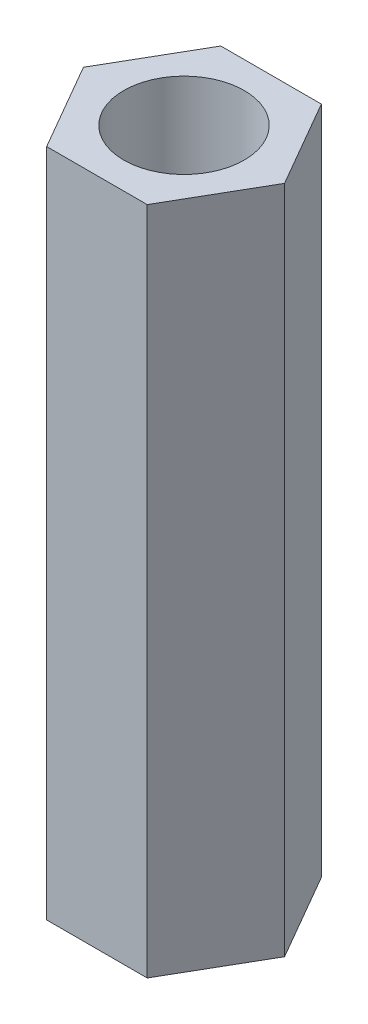
ISO-10303-21;
HEADER;
FILE_DESCRIPTION(('STEP AP214'),'2;1');
FILE_NAME('part.step','',(''),(''),'','','');
FILE_SCHEMA(('AUTOMOTIVE_DESIGN { 1 0 10303 214 1 1 1 1 }'));
ENDSEC;
DATA;
#1=APPLICATION_CONTEXT('core data for automotive mechanical design processes');
#2=APPLICATION_PROTOCOL_DEFINITION('international standard','automotive_design',2000,#1);
#3=PRODUCT_CONTEXT('',#1,'mechanical');
#4=PRODUCT('Part','Part','',(#3));
#5=PRODUCT_RELATED_PRODUCT_CATEGORY('part','',(#4));
#6=PRODUCT_DEFINITION_FORMATION('','',#4);
#7=PRODUCT_DEFINITION_CONTEXT('part definition',#1,'design');
#8=PRODUCT_DEFINITION('design','',#6,#7);
#9=PRODUCT_DEFINITION_SHAPE('','',#8);
#10=(LENGTH_UNIT() NAMED_UNIT(*) SI_UNIT(.MILLI.,.METRE.));
#11=(NAMED_UNIT(*) PLANE_ANGLE_UNIT() SI_UNIT($,.RADIAN.));
#12=(NAMED_UNIT(*) SI_UNIT($,.STERADIAN.) SOLID_ANGLE_UNIT());
#13=UNCERTAINTY_MEASURE_WITH_UNIT(LENGTH_MEASURE(1.E-05),#10,'distance_accuracy_value','');
#14=(GEOMETRIC_REPRESENTATION_CONTEXT(3) GLOBAL_UNCERTAINTY_ASSIGNED_CONTEXT((#13)) GLOBAL_UNIT_ASSIGNED_CONTEXT((#10,
#11,#12)) REPRESENTATION_CONTEXT('',''));
#15=CARTESIAN_POINT('',(0.,0.,0.));
#16=DIRECTION('',(0.,0.,1.));
#17=DIRECTION('',(1.,0.,0.));
#18=AXIS2_PLACEMENT_3D('',#15,#16,#17);
#19=CARTESIAN_POINT('',(0.,12.5,0.));
#20=DIRECTION('',(0.,1.,0.));
#21=DIRECTION('',(0.,0.,1.));
#22=AXIS2_PLACEMENT_3D('',#19,#20,#21);
#23=PLANE('',#22);
#24=DIRECTION('',(-0.5,0.,-0.866025403784439));
#25=VECTOR('',#24,1.);
#26=CARTESIAN_POINT('',(3.75277674973257,12.5,0.));
#27=LINE('',#26,#25);
#28=CARTESIAN_POINT('',(3.75277674973257,12.5,0.));
#29=VERTEX_POINT('',#28);
#30=CARTESIAN_POINT('',(1.87638837486628,12.5,-3.25));
#31=VERTEX_POINT('',#30);
#32=EDGE_CURVE('E128',#29,#31,#27,.T.);
#33=ORIENTED_EDGE('',*,*,#32,.T.);
#34=DIRECTION('',(-1.,0.,0.));
#35=VECTOR('',#34,1.);
#36=CARTESIAN_POINT('',(1.87638837486628,12.5,-3.25));
#37=LINE('',#36,#35);
#38=CARTESIAN_POINT('',(-1.87638837486628,12.5,-3.25));
#39=VERTEX_POINT('',#38);
#40=EDGE_CURVE('E86',#31,#39,#37,.T.);
#41=ORIENTED_EDGE('',*,*,#40,.T.);
#42=DIRECTION('',(-0.5,0.,0.866025403784439));
#43=VECTOR('',#42,1.);
#44=CARTESIAN_POINT('',(-1.87638837486628,12.5,-3.25));
#45=LINE('',#44,#43);
#46=CARTESIAN_POINT('',(-3.75277674973257,12.5,0.));
#47=VERTEX_POINT('',#46);
#48=EDGE_CURVE('E99',#39,#47,#45,.T.);
#49=ORIENTED_EDGE('',*,*,#48,.T.);
#50=DIRECTION('',(0.5,0.,0.866025403784438));
#51=VECTOR('',#50,1.);
#52=CARTESIAN_POINT('',(-3.75277674973257,12.5,0.));
#53=LINE('',#52,#51);
#54=CARTESIAN_POINT('',(-1.87638837486628,12.5,3.25));
#55=VERTEX_POINT('',#54);
#56=EDGE_CURVE('E93',#47,#55,#53,.T.);
#57=ORIENTED_EDGE('',*,*,#56,.T.);
#58=DIRECTION('',(1.,0.,0.));
#59=VECTOR('',#58,1.);
#60=CARTESIAN_POINT('',(-1.87638837486628,12.5,3.25));
#61=LINE('',#60,#59);
#62=CARTESIAN_POINT('',(1.87638837486628,12.5,3.25));
#63=VERTEX_POINT('',#62);
#64=EDGE_CURVE('E97',#55,#63,#61,.T.);
#65=ORIENTED_EDGE('',*,*,#64,.T.);
#66=DIRECTION('',(0.5,0.,-0.866025403784439));
#67=VECTOR('',#66,1.);
#68=CARTESIAN_POINT('',(1.87638837486628,12.5,3.25));
#69=LINE('',#68,#67);
#70=EDGE_CURVE('E49',#63,#29,#69,.T.);
#71=ORIENTED_EDGE('',*,*,#70,.T.);
#72=EDGE_LOOP('',(#33,#41,#49,#57,#65,#71));
#73=FACE_BOUND('',#72,.T.);
#74=CARTESIAN_POINT('',(0.,12.5,0.));
#75=DIRECTION('',(0.,1.,0.));
#76=DIRECTION('',(0.,0.,1.));
#77=AXIS2_PLACEMENT_3D('',#74,#75,#76);
#78=CIRCLE('',#77,2.25);
#79=CARTESIAN_POINT('',(0.,12.5,2.25));
#80=VERTEX_POINT('',#79);
#81=EDGE_CURVE('E121',#80,#80,#78,.T.);
#82=ORIENTED_EDGE('',*,*,#81,.F.);
#83=EDGE_LOOP('',(#82));
#84=FACE_BOUND('',#83,.T.);
#85=ADVANCED_FACE('F32',(#73,#84),#23,.T.);
#86=CARTESIAN_POINT('',(0.,-12.5,0.));
#87=DIRECTION('',(0.,1.,0.));
#88=DIRECTION('',(0.,0.,1.));
#89=AXIS2_PLACEMENT_3D('',#86,#87,#88);
#90=PLANE('',#89);
#91=DIRECTION('',(-0.5,0.,-0.866025403784439));
#92=VECTOR('',#91,1.);
#93=CARTESIAN_POINT('',(3.75277674973257,-12.5,0.));
#94=LINE('',#93,#92);
#95=CARTESIAN_POINT('',(3.75277674973257,-12.5,0.));
#96=VERTEX_POINT('',#95);
#97=CARTESIAN_POINT('',(1.87638837486628,-12.5,-3.25));
#98=VERTEX_POINT('',#97);
#99=EDGE_CURVE('E117',#96,#98,#94,.T.);
#100=ORIENTED_EDGE('',*,*,#99,.F.);
#101=DIRECTION('',(0.5,0.,-0.866025403784439));
#102=VECTOR('',#101,1.);
#103=CARTESIAN_POINT('',(1.87638837486628,-12.5,3.25));
#104=LINE('',#103,#102);
#105=CARTESIAN_POINT('',(1.87638837486628,-12.5,3.25));
#106=VERTEX_POINT('',#105);
#107=EDGE_CURVE('E78',#106,#96,#104,.T.);
#108=ORIENTED_EDGE('',*,*,#107,.F.);
#109=DIRECTION('',(1.,0.,0.));
#110=VECTOR('',#109,1.);
#111=CARTESIAN_POINT('',(-1.87638837486628,-12.5,3.25));
#112=LINE('',#111,#110);
#113=CARTESIAN_POINT('',(-1.87638837486628,-12.5,3.25));
#114=VERTEX_POINT('',#113);
#115=EDGE_CURVE('E72',#114,#106,#112,.T.);
#116=ORIENTED_EDGE('',*,*,#115,.F.);
#117=DIRECTION('',(0.5,0.,0.866025403784438));
#118=VECTOR('',#117,1.);
#119=CARTESIAN_POINT('',(-3.75277674973257,-12.5,0.));
#120=LINE('',#119,#118);
#121=CARTESIAN_POINT('',(-3.75277674973257,-12.5,0.));
#122=VERTEX_POINT('',#121);
#123=EDGE_CURVE('E107',#122,#114,#120,.T.);
#124=ORIENTED_EDGE('',*,*,#123,.F.);
#125=DIRECTION('',(-0.5,0.,0.866025403784439));
#126=VECTOR('',#125,1.);
#127=CARTESIAN_POINT('',(-1.87638837486628,-12.5,-3.25));
#128=LINE('',#127,#126);
#129=CARTESIAN_POINT('',(-1.87638837486628,-12.5,-3.25));
#130=VERTEX_POINT('',#129);
#131=EDGE_CURVE('E123',#130,#122,#128,.T.);
#132=ORIENTED_EDGE('',*,*,#131,.F.);
#133=DIRECTION('',(-1.,0.,0.));
#134=VECTOR('',#133,1.);
#135=CARTESIAN_POINT('',(1.87638837486628,-12.5,-3.25));
#136=LINE('',#135,#134);
#137=EDGE_CURVE('E120',#98,#130,#136,.T.);
#138=ORIENTED_EDGE('',*,*,#137,.F.);
#139=EDGE_LOOP('',(#100,#108,#116,#124,#132,#138));
#140=FACE_BOUND('',#139,.T.);
#141=CARTESIAN_POINT('',(0.,-12.5,0.));
#142=DIRECTION('',(0.,1.,0.));
#143=DIRECTION('',(0.,0.,1.));
#144=AXIS2_PLACEMENT_3D('',#141,#142,#143);
#145=CIRCLE('',#144,2.25);
#146=CARTESIAN_POINT('',(0.,-12.5,2.25));
#147=VERTEX_POINT('',#146);
#148=EDGE_CURVE('E221',#147,#147,#145,.T.);
#149=ORIENTED_EDGE('',*,*,#148,.T.);
#150=EDGE_LOOP('',(#149));
#151=FACE_BOUND('',#150,.T.);
#152=ADVANCED_FACE('F137',(#140,#151),#90,.F.);
#153=CARTESIAN_POINT('',(3.75277674973257,12.5,0.));
#154=DIRECTION('',(-0.866025403784439,0.,0.5));
#155=DIRECTION('',(0.5,0.,0.866025403784439));
#156=AXIS2_PLACEMENT_3D('',#153,#154,#155);
#157=PLANE('',#156);
#158=ORIENTED_EDGE('',*,*,#99,.T.);
#159=DIRECTION('',(0.,-1.,0.));
#160=VECTOR('',#159,1.);
#161=CARTESIAN_POINT('',(1.87638837486628,12.5,-3.25));
#162=LINE('',#161,#160);
#163=EDGE_CURVE('E11',#31,#98,#162,.T.);
#164=ORIENTED_EDGE('',*,*,#163,.F.);
#165=ORIENTED_EDGE('',*,*,#32,.F.);
#166=DIRECTION('',(0.,-1.,0.));
#167=VECTOR('',#166,1.);
#168=CARTESIAN_POINT('',(3.75277674973257,12.5,0.));
#169=LINE('',#168,#167);
#170=EDGE_CURVE('E113',#29,#96,#169,.T.);
#171=ORIENTED_EDGE('',*,*,#170,.T.);
#172=EDGE_LOOP('',(#158,#164,#165,#171));
#173=FACE_BOUND('',#172,.T.);
#174=ADVANCED_FACE('F34',(#173),#157,.F.);
#175=CARTESIAN_POINT('',(1.87638837486628,12.5,-3.25));
#176=DIRECTION('',(0.,0.,1.));
#177=DIRECTION('',(1.,0.,0.));
#178=AXIS2_PLACEMENT_3D('',#175,#176,#177);
#179=PLANE('',#178);
#180=ORIENTED_EDGE('',*,*,#137,.T.);
#181=DIRECTION('',(0.,-1.,0.));
#182=VECTOR('',#181,1.);
#183=CARTESIAN_POINT('',(-1.87638837486628,12.5,-3.25));
#184=LINE('',#183,#182);
#185=EDGE_CURVE('E41',#39,#130,#184,.T.);
#186=ORIENTED_EDGE('',*,*,#185,.F.);
#187=ORIENTED_EDGE('',*,*,#40,.F.);
#188=ORIENTED_EDGE('',*,*,#163,.T.);
#189=EDGE_LOOP('',(#180,#186,#187,#188));
#190=FACE_BOUND('',#189,.T.);
#191=ADVANCED_FACE('F162',(#190),#179,.F.);
#192=CARTESIAN_POINT('',(-1.87638837486628,12.5,-3.25));
#193=DIRECTION('',(0.866025403784439,0.,0.5));
#194=DIRECTION('',(0.5,0.,-0.866025403784439));
#195=AXIS2_PLACEMENT_3D('',#192,#193,#194);
#196=PLANE('',#195);
#197=ORIENTED_EDGE('',*,*,#131,.T.);
#198=DIRECTION('',(0.,-1.,0.));
#199=VECTOR('',#198,1.);
#200=CARTESIAN_POINT('',(-3.75277674973257,12.5,0.));
#201=LINE('',#200,#199);
#202=EDGE_CURVE('E108',#47,#122,#201,.T.);
#203=ORIENTED_EDGE('',*,*,#202,.F.);
#204=ORIENTED_EDGE('',*,*,#48,.F.);
#205=ORIENTED_EDGE('',*,*,#185,.T.);
#206=EDGE_LOOP('',(#197,#203,#204,#205));
#207=FACE_BOUND('',#206,.T.);
#208=ADVANCED_FACE('F134',(#207),#196,.F.);
#209=CARTESIAN_POINT('',(-3.75277674973257,12.5,0.));
#210=DIRECTION('',(0.866025403784438,0.,-0.5));
#211=DIRECTION('',(-0.5,0.,-0.866025403784439));
#212=AXIS2_PLACEMENT_3D('',#209,#210,#211);
#213=PLANE('',#212);
#214=ORIENTED_EDGE('',*,*,#123,.T.);
#215=DIRECTION('',(0.,-1.,0.));
#216=VECTOR('',#215,1.);
#217=CARTESIAN_POINT('',(-1.87638837486628,12.5,3.25));
#218=LINE('',#217,#216);
#219=EDGE_CURVE('E104',#55,#114,#218,.T.);
#220=ORIENTED_EDGE('',*,*,#219,.F.);
#221=ORIENTED_EDGE('',*,*,#56,.F.);
#222=ORIENTED_EDGE('',*,*,#202,.T.);
#223=EDGE_LOOP('',(#214,#220,#221,#222));
#224=FACE_BOUND('',#223,.T.);
#225=ADVANCED_FACE('F105',(#224),#213,.F.);
#226=CARTESIAN_POINT('',(-1.87638837486628,12.5,3.25));
#227=DIRECTION('',(0.,0.,-1.));
#228=DIRECTION('',(-1.,0.,0.));
#229=AXIS2_PLACEMENT_3D('',#226,#227,#228);
#230=PLANE('',#229);
#231=ORIENTED_EDGE('',*,*,#115,.T.);
#232=DIRECTION('',(0.,-1.,0.));
#233=VECTOR('',#232,1.);
#234=CARTESIAN_POINT('',(1.87638837486628,12.5,3.25));
#235=LINE('',#234,#233);
#236=EDGE_CURVE('E109',#63,#106,#235,.T.);
#237=ORIENTED_EDGE('',*,*,#236,.F.);
#238=ORIENTED_EDGE('',*,*,#64,.F.);
#239=ORIENTED_EDGE('',*,*,#219,.T.);
#240=EDGE_LOOP('',(#231,#237,#238,#239));
#241=FACE_BOUND('',#240,.T.);
#242=ADVANCED_FACE('F111',(#241),#230,.F.);
#243=CARTESIAN_POINT('',(1.87638837486628,12.5,3.25));
#244=DIRECTION('',(-0.866025403784439,0.,-0.5));
#245=DIRECTION('',(-0.5,0.,0.866025403784439));
#246=AXIS2_PLACEMENT_3D('',#243,#244,#245);
#247=PLANE('',#246);
#248=ORIENTED_EDGE('',*,*,#107,.T.);
#249=ORIENTED_EDGE('',*,*,#170,.F.);
#250=ORIENTED_EDGE('',*,*,#70,.F.);
#251=ORIENTED_EDGE('',*,*,#236,.T.);
#252=EDGE_LOOP('',(#248,#249,#250,#251));
#253=FACE_BOUND('',#252,.T.);
#254=ADVANCED_FACE('F142',(#253),#247,.F.);
#255=CARTESIAN_POINT('',(0.,12.5,0.));
#256=DIRECTION('',(0.,-1.,0.));
#257=DIRECTION('',(0.,0.,-1.));
#258=AXIS2_PLACEMENT_3D('',#255,#256,#257);
#259=CYLINDRICAL_SURFACE('',#258,2.25);
#260=ORIENTED_EDGE('',*,*,#81,.T.);
#261=EDGE_LOOP('',(#260));
#262=FACE_BOUND('',#261,.T.);
#263=ORIENTED_EDGE('',*,*,#148,.F.);
#264=EDGE_LOOP('',(#263));
#265=FACE_BOUND('',#264,.T.);
#266=ADVANCED_FACE('F144',(#262,#265),#259,.F.);
#267=CLOSED_SHELL('',(#85,#152,#174,#191,#208,#225,#242,#254,#266));
#268=MANIFOLD_SOLID_BREP('B2',#267);
#269=ADVANCED_BREP_SHAPE_REPRESENTATION('',(#18,#268),#14);
#270=SHAPE_DEFINITION_REPRESENTATION(#9,#269);
ENDSEC;
END-ISO-10303-21;
